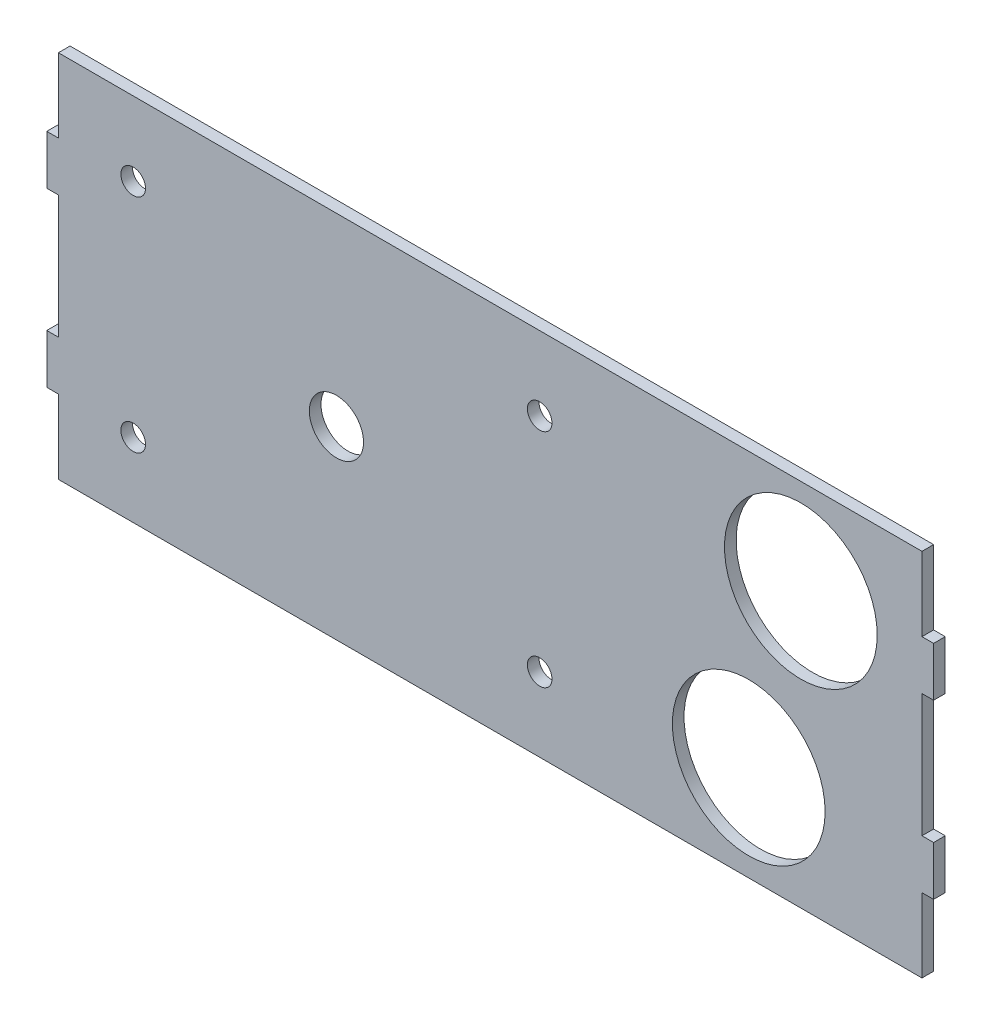
ISO-10303-21;
HEADER;
FILE_DESCRIPTION(('STEP AP214'),'2;1');
FILE_NAME('part.step','',(''),(''),'','','');
FILE_SCHEMA(('AUTOMOTIVE_DESIGN { 1 0 10303 214 1 1 1 1 }'));
ENDSEC;
DATA;
#1=APPLICATION_CONTEXT('core data for automotive mechanical design processes');
#2=APPLICATION_PROTOCOL_DEFINITION('international standard','automotive_design',2000,#1);
#3=PRODUCT_CONTEXT('',#1,'mechanical');
#4=PRODUCT('Part','Part','',(#3));
#5=PRODUCT_RELATED_PRODUCT_CATEGORY('part','',(#4));
#6=PRODUCT_DEFINITION_FORMATION('','',#4);
#7=PRODUCT_DEFINITION_CONTEXT('part definition',#1,'design');
#8=PRODUCT_DEFINITION('design','',#6,#7);
#9=PRODUCT_DEFINITION_SHAPE('','',#8);
#10=(LENGTH_UNIT() NAMED_UNIT(*) SI_UNIT(.MILLI.,.METRE.));
#11=(NAMED_UNIT(*) PLANE_ANGLE_UNIT() SI_UNIT($,.RADIAN.));
#12=(NAMED_UNIT(*) SI_UNIT($,.STERADIAN.) SOLID_ANGLE_UNIT());
#13=UNCERTAINTY_MEASURE_WITH_UNIT(LENGTH_MEASURE(1.E-05),#10,'distance_accuracy_value','');
#14=(GEOMETRIC_REPRESENTATION_CONTEXT(3) GLOBAL_UNCERTAINTY_ASSIGNED_CONTEXT((#13)) GLOBAL_UNIT_ASSIGNED_CONTEXT((#10,
#11,#12)) REPRESENTATION_CONTEXT('',''));
#15=CARTESIAN_POINT('',(0.,0.,0.));
#16=DIRECTION('',(0.,0.,1.));
#17=DIRECTION('',(1.,0.,0.));
#18=AXIS2_PLACEMENT_3D('',#15,#16,#17);
#19=CARTESIAN_POINT('',(-119.363142231198,35.9945777825327,2.3622));
#20=DIRECTION('',(0.,-1.,0.));
#21=DIRECTION('',(0.,0.,-1.));
#22=AXIS2_PLACEMENT_3D('',#19,#20,#21);
#23=PLANE('',#22);
#24=DIRECTION('',(-1.,0.,0.));
#25=VECTOR('',#24,1.);
#26=CARTESIAN_POINT('',(-119.363142231198,35.9945777825327,0.));
#27=LINE('',#26,#25);
#28=CARTESIAN_POINT('',(55.9124577688024,35.9945777825327,0.));
#29=VERTEX_POINT('',#28);
#30=CARTESIAN_POINT('',(-119.363142231198,35.9945777825327,0.));
#31=VERTEX_POINT('',#30);
#32=EDGE_CURVE('E212',#29,#31,#27,.T.);
#33=ORIENTED_EDGE('',*,*,#32,.T.);
#34=DIRECTION('',(0.,0.,-1.));
#35=VECTOR('',#34,1.);
#36=CARTESIAN_POINT('',(-119.363142231198,35.9945777825327,2.3622));
#37=LINE('',#36,#35);
#38=CARTESIAN_POINT('',(-119.363142231198,35.9945777825327,2.3622));
#39=VERTEX_POINT('',#38);
#40=EDGE_CURVE('E11',#39,#31,#37,.T.);
#41=ORIENTED_EDGE('',*,*,#40,.F.);
#42=DIRECTION('',(-1.,0.,0.));
#43=VECTOR('',#42,1.);
#44=CARTESIAN_POINT('',(-119.363142231198,35.9945777825327,2.3622));
#45=LINE('',#44,#43);
#46=CARTESIAN_POINT('',(55.9124577688024,35.9945777825327,2.3622));
#47=VERTEX_POINT('',#46);
#48=EDGE_CURVE('E271',#47,#39,#45,.T.);
#49=ORIENTED_EDGE('',*,*,#48,.F.);
#50=DIRECTION('',(0.,0.,-1.));
#51=VECTOR('',#50,1.);
#52=CARTESIAN_POINT('',(55.9124577688024,35.9945777825327,2.3622));
#53=LINE('',#52,#51);
#54=EDGE_CURVE('E208',#47,#29,#53,.T.);
#55=ORIENTED_EDGE('',*,*,#54,.T.);
#56=EDGE_LOOP('',(#33,#41,#49,#55));
#57=FACE_BOUND('',#56,.T.);
#58=ADVANCED_FACE('F39',(#57),#23,.F.);
#59=CARTESIAN_POINT('',(-119.363142231198,35.9945777825327,2.3622));
#60=DIRECTION('',(1.,0.,0.));
#61=DIRECTION('',(0.,1.,0.));
#62=AXIS2_PLACEMENT_3D('',#59,#60,#61);
#63=PLANE('',#62);
#64=DIRECTION('',(0.,-1.,0.));
#65=VECTOR('',#64,1.);
#66=CARTESIAN_POINT('',(-119.363142231198,35.9945777825327,0.));
#67=LINE('',#66,#65);
#68=CARTESIAN_POINT('',(-119.363142231198,20.9945777825327,0.));
#69=VERTEX_POINT('',#68);
#70=EDGE_CURVE('E216',#31,#69,#67,.T.);
#71=ORIENTED_EDGE('',*,*,#70,.T.);
#72=DIRECTION('',(0.,0.,-1.));
#73=VECTOR('',#72,1.);
#74=CARTESIAN_POINT('',(-119.363142231198,20.9945777825327,2.3622));
#75=LINE('',#74,#73);
#76=CARTESIAN_POINT('',(-119.363142231198,20.9945777825327,2.3622));
#77=VERTEX_POINT('',#76);
#78=EDGE_CURVE('E48',#77,#69,#75,.T.);
#79=ORIENTED_EDGE('',*,*,#78,.F.);
#80=DIRECTION('',(0.,-1.,0.));
#81=VECTOR('',#80,1.);
#82=CARTESIAN_POINT('',(-119.363142231198,35.9945777825327,2.3622));
#83=LINE('',#82,#81);
#84=EDGE_CURVE('E135',#39,#77,#83,.T.);
#85=ORIENTED_EDGE('',*,*,#84,.F.);
#86=ORIENTED_EDGE('',*,*,#40,.T.);
#87=EDGE_LOOP('',(#71,#79,#85,#86));
#88=FACE_BOUND('',#87,.T.);
#89=ADVANCED_FACE('F422',(#88),#63,.F.);
#90=CARTESIAN_POINT('',(-119.363142231198,20.9945777825327,2.3622));
#91=DIRECTION('',(0.,-1.,0.));
#92=DIRECTION('',(0.,0.,-1.));
#93=AXIS2_PLACEMENT_3D('',#90,#91,#92);
#94=PLANE('',#93);
#95=DIRECTION('',(-1.,0.,0.));
#96=VECTOR('',#95,1.);
#97=CARTESIAN_POINT('',(-119.363142231198,20.9945777825327,0.));
#98=LINE('',#97,#96);
#99=CARTESIAN_POINT('',(-121.725342231198,20.9945777825327,0.));
#100=VERTEX_POINT('',#99);
#101=EDGE_CURVE('E220',#69,#100,#98,.T.);
#102=ORIENTED_EDGE('',*,*,#101,.T.);
#103=DIRECTION('',(0.,0.,-1.));
#104=VECTOR('',#103,1.);
#105=CARTESIAN_POINT('',(-121.725342231198,20.9945777825327,2.3622));
#106=LINE('',#105,#104);
#107=CARTESIAN_POINT('',(-121.725342231198,20.9945777825327,2.3622));
#108=VERTEX_POINT('',#107);
#109=EDGE_CURVE('E330',#108,#100,#106,.T.);
#110=ORIENTED_EDGE('',*,*,#109,.F.);
#111=DIRECTION('',(-1.,0.,0.));
#112=VECTOR('',#111,1.);
#113=CARTESIAN_POINT('',(-119.363142231198,20.9945777825327,2.3622));
#114=LINE('',#113,#112);
#115=EDGE_CURVE('E340',#77,#108,#114,.T.);
#116=ORIENTED_EDGE('',*,*,#115,.F.);
#117=ORIENTED_EDGE('',*,*,#78,.T.);
#118=EDGE_LOOP('',(#102,#110,#116,#117));
#119=FACE_BOUND('',#118,.T.);
#120=ADVANCED_FACE('F338',(#119),#94,.F.);
#121=CARTESIAN_POINT('',(-121.725342231198,20.9945777825327,2.3622));
#122=DIRECTION('',(1.,0.,0.));
#123=DIRECTION('',(0.,0.,-1.));
#124=AXIS2_PLACEMENT_3D('',#121,#122,#123);
#125=PLANE('',#124);
#126=DIRECTION('',(0.,-1.,0.));
#127=VECTOR('',#126,1.);
#128=CARTESIAN_POINT('',(-121.725342231198,20.9945777825327,0.));
#129=LINE('',#128,#127);
#130=CARTESIAN_POINT('',(-121.725342231198,10.9945777825327,0.));
#131=VERTEX_POINT('',#130);
#132=EDGE_CURVE('E223',#100,#131,#129,.T.);
#133=ORIENTED_EDGE('',*,*,#132,.T.);
#134=DIRECTION('',(0.,0.,-1.));
#135=VECTOR('',#134,1.);
#136=CARTESIAN_POINT('',(-121.725342231198,10.9945777825327,2.3622));
#137=LINE('',#136,#135);
#138=CARTESIAN_POINT('',(-121.725342231198,10.9945777825327,2.3622));
#139=VERTEX_POINT('',#138);
#140=EDGE_CURVE('E326',#139,#131,#137,.T.);
#141=ORIENTED_EDGE('',*,*,#140,.F.);
#142=DIRECTION('',(0.,-1.,0.));
#143=VECTOR('',#142,1.);
#144=CARTESIAN_POINT('',(-121.725342231198,20.9945777825327,2.3622));
#145=LINE('',#144,#143);
#146=EDGE_CURVE('E359',#108,#139,#145,.T.);
#147=ORIENTED_EDGE('',*,*,#146,.F.);
#148=ORIENTED_EDGE('',*,*,#109,.T.);
#149=EDGE_LOOP('',(#133,#141,#147,#148));
#150=FACE_BOUND('',#149,.T.);
#151=ADVANCED_FACE('F349',(#150),#125,.F.);
#152=CARTESIAN_POINT('',(-121.725342231198,10.9945777825327,2.3622));
#153=DIRECTION('',(0.,1.,0.));
#154=DIRECTION('',(-1.,0.,0.));
#155=AXIS2_PLACEMENT_3D('',#152,#153,#154);
#156=PLANE('',#155);
#157=DIRECTION('',(1.,0.,0.));
#158=VECTOR('',#157,1.);
#159=CARTESIAN_POINT('',(-121.725342231198,10.9945777825327,0.));
#160=LINE('',#159,#158);
#161=CARTESIAN_POINT('',(-119.363142231198,10.9945777825327,0.));
#162=VERTEX_POINT('',#161);
#163=EDGE_CURVE('E226',#131,#162,#160,.T.);
#164=ORIENTED_EDGE('',*,*,#163,.T.);
#165=DIRECTION('',(0.,0.,-1.));
#166=VECTOR('',#165,1.);
#167=CARTESIAN_POINT('',(-119.363142231198,10.9945777825327,2.3622));
#168=LINE('',#167,#166);
#169=CARTESIAN_POINT('',(-119.363142231198,10.9945777825327,2.3622));
#170=VERTEX_POINT('',#169);
#171=EDGE_CURVE('E322',#170,#162,#168,.T.);
#172=ORIENTED_EDGE('',*,*,#171,.F.);
#173=DIRECTION('',(1.,0.,0.));
#174=VECTOR('',#173,1.);
#175=CARTESIAN_POINT('',(-121.725342231198,10.9945777825327,2.3622));
#176=LINE('',#175,#174);
#177=EDGE_CURVE('E355',#139,#170,#176,.T.);
#178=ORIENTED_EDGE('',*,*,#177,.F.);
#179=ORIENTED_EDGE('',*,*,#140,.T.);
#180=EDGE_LOOP('',(#164,#172,#178,#179));
#181=FACE_BOUND('',#180,.T.);
#182=ADVANCED_FACE('F353',(#181),#156,.F.);
#183=CARTESIAN_POINT('',(-119.363142231198,10.9945777825327,2.3622));
#184=DIRECTION('',(1.,0.,0.));
#185=DIRECTION('',(0.,0.,-1.));
#186=AXIS2_PLACEMENT_3D('',#183,#184,#185);
#187=PLANE('',#186);
#188=DIRECTION('',(0.,-1.,0.));
#189=VECTOR('',#188,1.);
#190=CARTESIAN_POINT('',(-119.363142231198,10.9945777825327,0.));
#191=LINE('',#190,#189);
#192=CARTESIAN_POINT('',(-119.363142231198,-14.0054222174673,0.));
#193=VERTEX_POINT('',#192);
#194=EDGE_CURVE('E229',#162,#193,#191,.T.);
#195=ORIENTED_EDGE('',*,*,#194,.T.);
#196=DIRECTION('',(0.,0.,-1.));
#197=VECTOR('',#196,1.);
#198=CARTESIAN_POINT('',(-119.363142231198,-14.0054222174673,2.3622));
#199=LINE('',#198,#197);
#200=CARTESIAN_POINT('',(-119.363142231198,-14.0054222174673,2.3622));
#201=VERTEX_POINT('',#200);
#202=EDGE_CURVE('E318',#201,#193,#199,.T.);
#203=ORIENTED_EDGE('',*,*,#202,.F.);
#204=DIRECTION('',(0.,-1.,0.));
#205=VECTOR('',#204,1.);
#206=CARTESIAN_POINT('',(-119.363142231198,10.9945777825327,2.3622));
#207=LINE('',#206,#205);
#208=EDGE_CURVE('E358',#170,#201,#207,.T.);
#209=ORIENTED_EDGE('',*,*,#208,.F.);
#210=ORIENTED_EDGE('',*,*,#171,.T.);
#211=EDGE_LOOP('',(#195,#203,#209,#210));
#212=FACE_BOUND('',#211,.T.);
#213=ADVANCED_FACE('F435',(#212),#187,.F.);
#214=CARTESIAN_POINT('',(-119.363142231198,-14.0054222174673,2.3622));
#215=DIRECTION('',(0.,-1.,0.));
#216=DIRECTION('',(0.,0.,-1.));
#217=AXIS2_PLACEMENT_3D('',#214,#215,#216);
#218=PLANE('',#217);
#219=DIRECTION('',(-1.,0.,0.));
#220=VECTOR('',#219,1.);
#221=CARTESIAN_POINT('',(-119.363142231198,-14.0054222174673,0.));
#222=LINE('',#221,#220);
#223=CARTESIAN_POINT('',(-121.725342231198,-14.0054222174673,0.));
#224=VERTEX_POINT('',#223);
#225=EDGE_CURVE('E232',#193,#224,#222,.T.);
#226=ORIENTED_EDGE('',*,*,#225,.T.);
#227=DIRECTION('',(0.,0.,-1.));
#228=VECTOR('',#227,1.);
#229=CARTESIAN_POINT('',(-121.725342231198,-14.0054222174673,2.3622));
#230=LINE('',#229,#228);
#231=CARTESIAN_POINT('',(-121.725342231198,-14.0054222174673,2.3622));
#232=VERTEX_POINT('',#231);
#233=EDGE_CURVE('E314',#232,#224,#230,.T.);
#234=ORIENTED_EDGE('',*,*,#233,.F.);
#235=DIRECTION('',(-1.,0.,0.));
#236=VECTOR('',#235,1.);
#237=CARTESIAN_POINT('',(-119.363142231198,-14.0054222174673,2.3622));
#238=LINE('',#237,#236);
#239=EDGE_CURVE('E363',#201,#232,#238,.T.);
#240=ORIENTED_EDGE('',*,*,#239,.F.);
#241=ORIENTED_EDGE('',*,*,#202,.T.);
#242=EDGE_LOOP('',(#226,#234,#240,#241));
#243=FACE_BOUND('',#242,.T.);
#244=ADVANCED_FACE('F438',(#243),#218,.F.);
#245=CARTESIAN_POINT('',(-121.725342231198,-14.0054222174673,2.3622));
#246=DIRECTION('',(1.,0.,0.));
#247=DIRECTION('',(0.,0.,-1.));
#248=AXIS2_PLACEMENT_3D('',#245,#246,#247);
#249=PLANE('',#248);
#250=DIRECTION('',(0.,-1.,0.));
#251=VECTOR('',#250,1.);
#252=CARTESIAN_POINT('',(-121.725342231198,-14.0054222174673,0.));
#253=LINE('',#252,#251);
#254=CARTESIAN_POINT('',(-121.725342231198,-24.0054222174673,0.));
#255=VERTEX_POINT('',#254);
#256=EDGE_CURVE('E235',#224,#255,#253,.T.);
#257=ORIENTED_EDGE('',*,*,#256,.T.);
#258=DIRECTION('',(0.,0.,-1.));
#259=VECTOR('',#258,1.);
#260=CARTESIAN_POINT('',(-121.725342231198,-24.0054222174673,2.3622));
#261=LINE('',#260,#259);
#262=CARTESIAN_POINT('',(-121.725342231198,-24.0054222174673,2.3622));
#263=VERTEX_POINT('',#262);
#264=EDGE_CURVE('E310',#263,#255,#261,.T.);
#265=ORIENTED_EDGE('',*,*,#264,.F.);
#266=DIRECTION('',(0.,-1.,0.));
#267=VECTOR('',#266,1.);
#268=CARTESIAN_POINT('',(-121.725342231198,-14.0054222174673,2.3622));
#269=LINE('',#268,#267);
#270=EDGE_CURVE('E370',#232,#263,#269,.T.);
#271=ORIENTED_EDGE('',*,*,#270,.F.);
#272=ORIENTED_EDGE('',*,*,#233,.T.);
#273=EDGE_LOOP('',(#257,#265,#271,#272));
#274=FACE_BOUND('',#273,.T.);
#275=ADVANCED_FACE('F442',(#274),#249,.F.);
#276=CARTESIAN_POINT('',(-121.725342231198,-24.0054222174673,2.3622));
#277=DIRECTION('',(0.,1.,0.));
#278=DIRECTION('',(-1.,0.,0.));
#279=AXIS2_PLACEMENT_3D('',#276,#277,#278);
#280=PLANE('',#279);
#281=DIRECTION('',(1.,0.,0.));
#282=VECTOR('',#281,1.);
#283=CARTESIAN_POINT('',(-121.725342231198,-24.0054222174673,0.));
#284=LINE('',#283,#282);
#285=CARTESIAN_POINT('',(-119.363142231198,-24.0054222174673,0.));
#286=VERTEX_POINT('',#285);
#287=EDGE_CURVE('E238',#255,#286,#284,.T.);
#288=ORIENTED_EDGE('',*,*,#287,.T.);
#289=DIRECTION('',(0.,0.,-1.));
#290=VECTOR('',#289,1.);
#291=CARTESIAN_POINT('',(-119.363142231198,-24.0054222174673,2.3622));
#292=LINE('',#291,#290);
#293=CARTESIAN_POINT('',(-119.363142231198,-24.0054222174673,2.3622));
#294=VERTEX_POINT('',#293);
#295=EDGE_CURVE('E306',#294,#286,#292,.T.);
#296=ORIENTED_EDGE('',*,*,#295,.F.);
#297=DIRECTION('',(1.,0.,0.));
#298=VECTOR('',#297,1.);
#299=CARTESIAN_POINT('',(-121.725342231198,-24.0054222174673,2.3622));
#300=LINE('',#299,#298);
#301=EDGE_CURVE('E373',#263,#294,#300,.T.);
#302=ORIENTED_EDGE('',*,*,#301,.F.);
#303=ORIENTED_EDGE('',*,*,#264,.T.);
#304=EDGE_LOOP('',(#288,#296,#302,#303));
#305=FACE_BOUND('',#304,.T.);
#306=ADVANCED_FACE('F446',(#305),#280,.F.);
#307=CARTESIAN_POINT('',(-119.363142231198,-24.0054222174673,2.3622));
#308=DIRECTION('',(1.,0.,0.));
#309=DIRECTION('',(0.,0.,-1.));
#310=AXIS2_PLACEMENT_3D('',#307,#308,#309);
#311=PLANE('',#310);
#312=DIRECTION('',(0.,-1.,0.));
#313=VECTOR('',#312,1.);
#314=CARTESIAN_POINT('',(-119.363142231198,-24.0054222174673,0.));
#315=LINE('',#314,#313);
#316=CARTESIAN_POINT('',(-119.363142231198,-39.0054222174672,0.));
#317=VERTEX_POINT('',#316);
#318=EDGE_CURVE('E241',#286,#317,#315,.T.);
#319=ORIENTED_EDGE('',*,*,#318,.T.);
#320=DIRECTION('',(0.,0.,-1.));
#321=VECTOR('',#320,1.);
#322=CARTESIAN_POINT('',(-119.363142231198,-39.0054222174672,2.3622));
#323=LINE('',#322,#321);
#324=CARTESIAN_POINT('',(-119.363142231198,-39.0054222174672,2.3622));
#325=VERTEX_POINT('',#324);
#326=EDGE_CURVE('E302',#325,#317,#323,.T.);
#327=ORIENTED_EDGE('',*,*,#326,.F.);
#328=DIRECTION('',(0.,-1.,0.));
#329=VECTOR('',#328,1.);
#330=CARTESIAN_POINT('',(-119.363142231198,-24.0054222174673,2.3622));
#331=LINE('',#330,#329);
#332=EDGE_CURVE('E376',#294,#325,#331,.T.);
#333=ORIENTED_EDGE('',*,*,#332,.F.);
#334=ORIENTED_EDGE('',*,*,#295,.T.);
#335=EDGE_LOOP('',(#319,#327,#333,#334));
#336=FACE_BOUND('',#335,.T.);
#337=ADVANCED_FACE('F450',(#336),#311,.F.);
#338=CARTESIAN_POINT('',(-119.363142231198,-39.0054222174672,2.3622));
#339=DIRECTION('',(0.,1.,0.));
#340=DIRECTION('',(0.,0.,1.));
#341=AXIS2_PLACEMENT_3D('',#338,#339,#340);
#342=PLANE('',#341);
#343=DIRECTION('',(1.,0.,0.));
#344=VECTOR('',#343,1.);
#345=CARTESIAN_POINT('',(-119.363142231198,-39.0054222174672,0.));
#346=LINE('',#345,#344);
#347=CARTESIAN_POINT('',(55.9124577688025,-39.0054222174672,0.));
#348=VERTEX_POINT('',#347);
#349=EDGE_CURVE('E244',#317,#348,#346,.T.);
#350=ORIENTED_EDGE('',*,*,#349,.T.);
#351=DIRECTION('',(0.,0.,-1.));
#352=VECTOR('',#351,1.);
#353=CARTESIAN_POINT('',(55.9124577688025,-39.0054222174672,2.3622));
#354=LINE('',#353,#352);
#355=CARTESIAN_POINT('',(55.9124577688025,-39.0054222174672,2.3622));
#356=VERTEX_POINT('',#355);
#357=EDGE_CURVE('E298',#356,#348,#354,.T.);
#358=ORIENTED_EDGE('',*,*,#357,.F.);
#359=DIRECTION('',(1.,0.,0.));
#360=VECTOR('',#359,1.);
#361=CARTESIAN_POINT('',(-119.363142231198,-39.0054222174672,2.3622));
#362=LINE('',#361,#360);
#363=EDGE_CURVE('E379',#325,#356,#362,.T.);
#364=ORIENTED_EDGE('',*,*,#363,.F.);
#365=ORIENTED_EDGE('',*,*,#326,.T.);
#366=EDGE_LOOP('',(#350,#358,#364,#365));
#367=FACE_BOUND('',#366,.T.);
#368=ADVANCED_FACE('F454',(#367),#342,.F.);
#369=CARTESIAN_POINT('',(55.9124577688025,-24.0054222174673,2.3622));
#370=DIRECTION('',(-1.,0.,0.));
#371=DIRECTION('',(0.,-1.,0.));
#372=AXIS2_PLACEMENT_3D('',#369,#370,#371);
#373=PLANE('',#372);
#374=DIRECTION('',(0.,1.,0.));
#375=VECTOR('',#374,1.);
#376=CARTESIAN_POINT('',(55.9124577688025,-24.0054222174673,0.));
#377=LINE('',#376,#375);
#378=CARTESIAN_POINT('',(55.9124577688025,-24.0054222174673,0.));
#379=VERTEX_POINT('',#378);
#380=EDGE_CURVE('E247',#348,#379,#377,.T.);
#381=ORIENTED_EDGE('',*,*,#380,.T.);
#382=DIRECTION('',(0.,0.,-1.));
#383=VECTOR('',#382,1.);
#384=CARTESIAN_POINT('',(55.9124577688025,-24.0054222174673,2.3622));
#385=LINE('',#384,#383);
#386=CARTESIAN_POINT('',(55.9124577688025,-24.0054222174673,2.3622));
#387=VERTEX_POINT('',#386);
#388=EDGE_CURVE('E294',#387,#379,#385,.T.);
#389=ORIENTED_EDGE('',*,*,#388,.F.);
#390=DIRECTION('',(0.,1.,0.));
#391=VECTOR('',#390,1.);
#392=CARTESIAN_POINT('',(55.9124577688025,-24.0054222174673,2.3622));
#393=LINE('',#392,#391);
#394=EDGE_CURVE('E382',#356,#387,#393,.T.);
#395=ORIENTED_EDGE('',*,*,#394,.F.);
#396=ORIENTED_EDGE('',*,*,#357,.T.);
#397=EDGE_LOOP('',(#381,#389,#395,#396));
#398=FACE_BOUND('',#397,.T.);
#399=ADVANCED_FACE('F458',(#398),#373,.F.);
#400=CARTESIAN_POINT('',(58.2746577688025,-24.0054222174673,2.3622));
#401=DIRECTION('',(0.,1.,0.));
#402=DIRECTION('',(0.,0.,1.));
#403=AXIS2_PLACEMENT_3D('',#400,#401,#402);
#404=PLANE('',#403);
#405=DIRECTION('',(1.,0.,0.));
#406=VECTOR('',#405,1.);
#407=CARTESIAN_POINT('',(58.2746577688025,-24.0054222174673,0.));
#408=LINE('',#407,#406);
#409=CARTESIAN_POINT('',(58.2746577688025,-24.0054222174673,0.));
#410=VERTEX_POINT('',#409);
#411=EDGE_CURVE('E250',#379,#410,#408,.T.);
#412=ORIENTED_EDGE('',*,*,#411,.T.);
#413=DIRECTION('',(0.,0.,-1.));
#414=VECTOR('',#413,1.);
#415=CARTESIAN_POINT('',(58.2746577688025,-24.0054222174673,2.3622));
#416=LINE('',#415,#414);
#417=CARTESIAN_POINT('',(58.2746577688025,-24.0054222174673,2.3622));
#418=VERTEX_POINT('',#417);
#419=EDGE_CURVE('E290',#418,#410,#416,.T.);
#420=ORIENTED_EDGE('',*,*,#419,.F.);
#421=DIRECTION('',(1.,0.,0.));
#422=VECTOR('',#421,1.);
#423=CARTESIAN_POINT('',(58.2746577688025,-24.0054222174673,2.3622));
#424=LINE('',#423,#422);
#425=EDGE_CURVE('E385',#387,#418,#424,.T.);
#426=ORIENTED_EDGE('',*,*,#425,.F.);
#427=ORIENTED_EDGE('',*,*,#388,.T.);
#428=EDGE_LOOP('',(#412,#420,#426,#427));
#429=FACE_BOUND('',#428,.T.);
#430=ADVANCED_FACE('F462',(#429),#404,.F.);
#431=CARTESIAN_POINT('',(58.2746577688025,-14.0054222174673,2.3622));
#432=DIRECTION('',(-1.,0.,0.));
#433=DIRECTION('',(0.,0.,1.));
#434=AXIS2_PLACEMENT_3D('',#431,#432,#433);
#435=PLANE('',#434);
#436=DIRECTION('',(0.,1.,0.));
#437=VECTOR('',#436,1.);
#438=CARTESIAN_POINT('',(58.2746577688025,-14.0054222174673,0.));
#439=LINE('',#438,#437);
#440=CARTESIAN_POINT('',(58.2746577688025,-14.0054222174673,0.));
#441=VERTEX_POINT('',#440);
#442=EDGE_CURVE('E253',#410,#441,#439,.T.);
#443=ORIENTED_EDGE('',*,*,#442,.T.);
#444=DIRECTION('',(0.,0.,-1.));
#445=VECTOR('',#444,1.);
#446=CARTESIAN_POINT('',(58.2746577688025,-14.0054222174673,2.3622));
#447=LINE('',#446,#445);
#448=CARTESIAN_POINT('',(58.2746577688025,-14.0054222174673,2.3622));
#449=VERTEX_POINT('',#448);
#450=EDGE_CURVE('E286',#449,#441,#447,.T.);
#451=ORIENTED_EDGE('',*,*,#450,.F.);
#452=DIRECTION('',(0.,1.,0.));
#453=VECTOR('',#452,1.);
#454=CARTESIAN_POINT('',(58.2746577688025,-14.0054222174673,2.3622));
#455=LINE('',#454,#453);
#456=EDGE_CURVE('E388',#418,#449,#455,.T.);
#457=ORIENTED_EDGE('',*,*,#456,.F.);
#458=ORIENTED_EDGE('',*,*,#419,.T.);
#459=EDGE_LOOP('',(#443,#451,#457,#458));
#460=FACE_BOUND('',#459,.T.);
#461=ADVANCED_FACE('F466',(#460),#435,.F.);
#462=CARTESIAN_POINT('',(55.9124577688025,-14.0054222174673,2.3622));
#463=DIRECTION('',(0.,-1.,0.));
#464=DIRECTION('',(0.,0.,-1.));
#465=AXIS2_PLACEMENT_3D('',#462,#463,#464);
#466=PLANE('',#465);
#467=DIRECTION('',(-1.,0.,0.));
#468=VECTOR('',#467,1.);
#469=CARTESIAN_POINT('',(55.9124577688025,-14.0054222174673,0.));
#470=LINE('',#469,#468);
#471=CARTESIAN_POINT('',(55.9124577688025,-14.0054222174673,0.));
#472=VERTEX_POINT('',#471);
#473=EDGE_CURVE('E256',#441,#472,#470,.T.);
#474=ORIENTED_EDGE('',*,*,#473,.T.);
#475=DIRECTION('',(0.,0.,-1.));
#476=VECTOR('',#475,1.);
#477=CARTESIAN_POINT('',(55.9124577688025,-14.0054222174673,2.3622));
#478=LINE('',#477,#476);
#479=CARTESIAN_POINT('',(55.9124577688025,-14.0054222174673,2.3622));
#480=VERTEX_POINT('',#479);
#481=EDGE_CURVE('E282',#480,#472,#478,.T.);
#482=ORIENTED_EDGE('',*,*,#481,.F.);
#483=DIRECTION('',(-1.,0.,0.));
#484=VECTOR('',#483,1.);
#485=CARTESIAN_POINT('',(55.9124577688025,-14.0054222174673,2.3622));
#486=LINE('',#485,#484);
#487=EDGE_CURVE('E391',#449,#480,#486,.T.);
#488=ORIENTED_EDGE('',*,*,#487,.F.);
#489=ORIENTED_EDGE('',*,*,#450,.T.);
#490=EDGE_LOOP('',(#474,#482,#488,#489));
#491=FACE_BOUND('',#490,.T.);
#492=ADVANCED_FACE('F470',(#491),#466,.F.);
#493=CARTESIAN_POINT('',(55.9124577688025,10.9945777825327,2.3622));
#494=DIRECTION('',(-1.,0.,0.));
#495=DIRECTION('',(0.,0.,1.));
#496=AXIS2_PLACEMENT_3D('',#493,#494,#495);
#497=PLANE('',#496);
#498=DIRECTION('',(0.,1.,0.));
#499=VECTOR('',#498,1.);
#500=CARTESIAN_POINT('',(55.9124577688025,10.9945777825327,0.));
#501=LINE('',#500,#499);
#502=CARTESIAN_POINT('',(55.9124577688025,10.9945777825327,0.));
#503=VERTEX_POINT('',#502);
#504=EDGE_CURVE('E259',#472,#503,#501,.T.);
#505=ORIENTED_EDGE('',*,*,#504,.T.);
#506=DIRECTION('',(0.,0.,-1.));
#507=VECTOR('',#506,1.);
#508=CARTESIAN_POINT('',(55.9124577688025,10.9945777825327,2.3622));
#509=LINE('',#508,#507);
#510=CARTESIAN_POINT('',(55.9124577688025,10.9945777825327,2.3622));
#511=VERTEX_POINT('',#510);
#512=EDGE_CURVE('E278',#511,#503,#509,.T.);
#513=ORIENTED_EDGE('',*,*,#512,.F.);
#514=DIRECTION('',(0.,1.,0.));
#515=VECTOR('',#514,1.);
#516=CARTESIAN_POINT('',(55.9124577688025,10.9945777825327,2.3622));
#517=LINE('',#516,#515);
#518=EDGE_CURVE('E394',#480,#511,#517,.T.);
#519=ORIENTED_EDGE('',*,*,#518,.F.);
#520=ORIENTED_EDGE('',*,*,#481,.T.);
#521=EDGE_LOOP('',(#505,#513,#519,#520));
#522=FACE_BOUND('',#521,.T.);
#523=ADVANCED_FACE('F402',(#522),#497,.F.);
#524=CARTESIAN_POINT('',(58.2746577688025,10.9945777825327,2.3622));
#525=DIRECTION('',(0.,1.,0.));
#526=DIRECTION('',(-1.,0.,0.));
#527=AXIS2_PLACEMENT_3D('',#524,#525,#526);
#528=PLANE('',#527);
#529=DIRECTION('',(1.,0.,0.));
#530=VECTOR('',#529,1.);
#531=CARTESIAN_POINT('',(58.2746577688025,10.9945777825327,0.));
#532=LINE('',#531,#530);
#533=CARTESIAN_POINT('',(58.2746577688025,10.9945777825327,0.));
#534=VERTEX_POINT('',#533);
#535=EDGE_CURVE('E262',#503,#534,#532,.T.);
#536=ORIENTED_EDGE('',*,*,#535,.T.);
#537=DIRECTION('',(0.,0.,-1.));
#538=VECTOR('',#537,1.);
#539=CARTESIAN_POINT('',(58.2746577688025,10.9945777825327,2.3622));
#540=LINE('',#539,#538);
#541=CARTESIAN_POINT('',(58.2746577688025,10.9945777825327,2.3622));
#542=VERTEX_POINT('',#541);
#543=EDGE_CURVE('E201',#542,#534,#540,.T.);
#544=ORIENTED_EDGE('',*,*,#543,.F.);
#545=DIRECTION('',(1.,0.,0.));
#546=VECTOR('',#545,1.);
#547=CARTESIAN_POINT('',(58.2746577688025,10.9945777825327,2.3622));
#548=LINE('',#547,#546);
#549=EDGE_CURVE('E190',#511,#542,#548,.T.);
#550=ORIENTED_EDGE('',*,*,#549,.F.);
#551=ORIENTED_EDGE('',*,*,#512,.T.);
#552=EDGE_LOOP('',(#536,#544,#550,#551));
#553=FACE_BOUND('',#552,.T.);
#554=ADVANCED_FACE('F406',(#553),#528,.F.);
#555=CARTESIAN_POINT('',(58.2746577688025,20.9945777825327,2.3622));
#556=DIRECTION('',(-1.,0.,0.));
#557=DIRECTION('',(0.,-1.,0.));
#558=AXIS2_PLACEMENT_3D('',#555,#556,#557);
#559=PLANE('',#558);
#560=DIRECTION('',(0.,1.,0.));
#561=VECTOR('',#560,1.);
#562=CARTESIAN_POINT('',(58.2746577688025,20.9945777825327,0.));
#563=LINE('',#562,#561);
#564=CARTESIAN_POINT('',(58.2746577688025,20.9945777825327,0.));
#565=VERTEX_POINT('',#564);
#566=EDGE_CURVE('E199',#534,#565,#563,.T.);
#567=ORIENTED_EDGE('',*,*,#566,.T.);
#568=DIRECTION('',(0.,0.,-1.));
#569=VECTOR('',#568,1.);
#570=CARTESIAN_POINT('',(58.2746577688025,20.9945777825327,2.3622));
#571=LINE('',#570,#569);
#572=CARTESIAN_POINT('',(58.2746577688025,20.9945777825327,2.3622));
#573=VERTEX_POINT('',#572);
#574=EDGE_CURVE('E196',#573,#565,#571,.T.);
#575=ORIENTED_EDGE('',*,*,#574,.F.);
#576=DIRECTION('',(0.,1.,0.));
#577=VECTOR('',#576,1.);
#578=CARTESIAN_POINT('',(58.2746577688025,20.9945777825327,2.3622));
#579=LINE('',#578,#577);
#580=EDGE_CURVE('E184',#542,#573,#579,.T.);
#581=ORIENTED_EDGE('',*,*,#580,.F.);
#582=ORIENTED_EDGE('',*,*,#543,.T.);
#583=EDGE_LOOP('',(#567,#575,#581,#582));
#584=FACE_BOUND('',#583,.T.);
#585=ADVANCED_FACE('F197',(#584),#559,.F.);
#586=CARTESIAN_POINT('',(55.9124577688024,20.9945777825327,2.3622));
#587=DIRECTION('',(0.,-1.,0.));
#588=DIRECTION('',(0.,0.,-1.));
#589=AXIS2_PLACEMENT_3D('',#586,#587,#588);
#590=PLANE('',#589);
#591=DIRECTION('',(-1.,0.,0.));
#592=VECTOR('',#591,1.);
#593=CARTESIAN_POINT('',(55.9124577688024,20.9945777825327,0.));
#594=LINE('',#593,#592);
#595=CARTESIAN_POINT('',(55.9124577688024,20.9945777825327,0.));
#596=VERTEX_POINT('',#595);
#597=EDGE_CURVE('E121',#565,#596,#594,.T.);
#598=ORIENTED_EDGE('',*,*,#597,.T.);
#599=DIRECTION('',(0.,0.,-1.));
#600=VECTOR('',#599,1.);
#601=CARTESIAN_POINT('',(55.9124577688024,20.9945777825327,2.3622));
#602=LINE('',#601,#600);
#603=CARTESIAN_POINT('',(55.9124577688024,20.9945777825327,2.3622));
#604=VERTEX_POINT('',#603);
#605=EDGE_CURVE('E202',#604,#596,#602,.T.);
#606=ORIENTED_EDGE('',*,*,#605,.F.);
#607=DIRECTION('',(-1.,0.,0.));
#608=VECTOR('',#607,1.);
#609=CARTESIAN_POINT('',(55.9124577688024,20.9945777825327,2.3622));
#610=LINE('',#609,#608);
#611=EDGE_CURVE('E188',#573,#604,#610,.T.);
#612=ORIENTED_EDGE('',*,*,#611,.F.);
#613=ORIENTED_EDGE('',*,*,#574,.T.);
#614=EDGE_LOOP('',(#598,#606,#612,#613));
#615=FACE_BOUND('',#614,.T.);
#616=ADVANCED_FACE('F204',(#615),#590,.F.);
#617=CARTESIAN_POINT('',(55.9124577688024,35.9945777825327,2.3622));
#618=DIRECTION('',(-1.,0.,0.));
#619=DIRECTION('',(0.,0.,1.));
#620=AXIS2_PLACEMENT_3D('',#617,#618,#619);
#621=PLANE('',#620);
#622=DIRECTION('',(0.,1.,0.));
#623=VECTOR('',#622,1.);
#624=CARTESIAN_POINT('',(55.9124577688024,35.9945777825327,0.));
#625=LINE('',#624,#623);
#626=EDGE_CURVE('E127',#596,#29,#625,.T.);
#627=ORIENTED_EDGE('',*,*,#626,.T.);
#628=ORIENTED_EDGE('',*,*,#54,.F.);
#629=DIRECTION('',(0.,1.,0.));
#630=VECTOR('',#629,1.);
#631=CARTESIAN_POINT('',(55.9124577688024,35.9945777825327,2.3622));
#632=LINE('',#631,#630);
#633=EDGE_CURVE('E56',#604,#47,#632,.T.);
#634=ORIENTED_EDGE('',*,*,#633,.F.);
#635=ORIENTED_EDGE('',*,*,#605,.T.);
#636=EDGE_LOOP('',(#627,#628,#634,#635));
#637=FACE_BOUND('',#636,.T.);
#638=ADVANCED_FACE('F410',(#637),#621,.F.);
#639=CARTESIAN_POINT('',(0.,0.,2.3622));
#640=DIRECTION('',(0.,0.,-1.));
#641=DIRECTION('',(-1.,0.,0.));
#642=AXIS2_PLACEMENT_3D('',#639,#640,#641);
#643=PLANE('',#642);
#644=CARTESIAN_POINT('',(-62.9319659045439,-1.50542221746725,2.3622));
#645=DIRECTION('',(0.,0.,1.));
#646=DIRECTION('',(1.,0.,0.));
#647=AXIS2_PLACEMENT_3D('',#644,#645,#646);
#648=CIRCLE('',#647,5.49999999999999);
#649=CARTESIAN_POINT('',(-57.4319659045439,-1.50542221746725,2.3622));
#650=VERTEX_POINT('',#649);
#651=EDGE_CURVE('E586',#650,#650,#648,.T.);
#652=ORIENTED_EDGE('',*,*,#651,.F.);
#653=EDGE_LOOP('',(#652));
#654=FACE_BOUND('',#653,.T.);
#655=CARTESIAN_POINT('',(-21.6819659045439,20.9945777825327,2.3622));
#656=DIRECTION('',(0.,0.,1.));
#657=DIRECTION('',(1.,0.,0.));
#658=AXIS2_PLACEMENT_3D('',#655,#656,#657);
#659=CIRCLE('',#658,2.5);
#660=CARTESIAN_POINT('',(-19.1819659045439,20.9945777825327,2.3622));
#661=VERTEX_POINT('',#660);
#662=EDGE_CURVE('E592',#661,#661,#659,.T.);
#663=ORIENTED_EDGE('',*,*,#662,.F.);
#664=EDGE_LOOP('',(#663));
#665=FACE_BOUND('',#664,.T.);
#666=CARTESIAN_POINT('',(-104.181965904544,20.9945777825327,2.3622));
#667=DIRECTION('',(0.,0.,1.));
#668=DIRECTION('',(1.,0.,0.));
#669=AXIS2_PLACEMENT_3D('',#666,#667,#668);
#670=CIRCLE('',#669,2.5);
#671=CARTESIAN_POINT('',(-101.681965904544,20.9945777825327,2.3622));
#672=VERTEX_POINT('',#671);
#673=EDGE_CURVE('E612',#672,#672,#670,.T.);
#674=ORIENTED_EDGE('',*,*,#673,.F.);
#675=EDGE_LOOP('',(#674));
#676=FACE_BOUND('',#675,.T.);
#677=CARTESIAN_POINT('',(20.7536699578264,-19.6112584195055,2.3622));
#678=DIRECTION('',(0.,0.,1.));
#679=DIRECTION('',(1.,0.,0.));
#680=AXIS2_PLACEMENT_3D('',#677,#678,#679);
#681=CIRCLE('',#680,15.5);
#682=CARTESIAN_POINT('',(36.2536699578264,-19.6112584195055,2.3622));
#683=VERTEX_POINT('',#682);
#684=EDGE_CURVE('E604',#683,#683,#681,.T.);
#685=ORIENTED_EDGE('',*,*,#684,.F.);
#686=EDGE_LOOP('',(#685));
#687=FACE_BOUND('',#686,.T.);
#688=CARTESIAN_POINT('',(-21.6819659045439,-24.0054222174673,2.3622));
#689=DIRECTION('',(0.,0.,1.));
#690=DIRECTION('',(1.,0.,0.));
#691=AXIS2_PLACEMENT_3D('',#688,#689,#690);
#692=CIRCLE('',#691,2.5);
#693=CARTESIAN_POINT('',(-19.1819659045439,-24.0054222174673,2.3622));
#694=VERTEX_POINT('',#693);
#695=EDGE_CURVE('E595',#694,#694,#692,.T.);
#696=ORIENTED_EDGE('',*,*,#695,.F.);
#697=EDGE_LOOP('',(#696));
#698=FACE_BOUND('',#697,.T.);
#699=CARTESIAN_POINT('',(-104.181965904544,-24.0054222174673,2.3622));
#700=DIRECTION('',(0.,0.,1.));
#701=DIRECTION('',(1.,0.,0.));
#702=AXIS2_PLACEMENT_3D('',#699,#700,#701);
#703=CIRCLE('',#702,2.5);
#704=CARTESIAN_POINT('',(-101.681965904544,-24.0054222174673,2.3622));
#705=VERTEX_POINT('',#704);
#706=EDGE_CURVE('E635',#705,#705,#703,.T.);
#707=ORIENTED_EDGE('',*,*,#706,.F.);
#708=EDGE_LOOP('',(#707));
#709=FACE_BOUND('',#708,.T.);
#710=CARTESIAN_POINT('',(31.3281344449803,16.7215169978948,2.3622));
#711=DIRECTION('',(0.,0.,1.));
#712=DIRECTION('',(1.,0.,0.));
#713=AXIS2_PLACEMENT_3D('',#710,#711,#712);
#714=CIRCLE('',#713,15.5);
#715=CARTESIAN_POINT('',(46.8281344449803,16.7215169978948,2.3622));
#716=VERTEX_POINT('',#715);
#717=EDGE_CURVE('E603',#716,#716,#714,.T.);
#718=ORIENTED_EDGE('',*,*,#717,.F.);
#719=EDGE_LOOP('',(#718));
#720=FACE_BOUND('',#719,.T.);
#721=ORIENTED_EDGE('',*,*,#48,.T.);
#722=ORIENTED_EDGE('',*,*,#84,.T.);
#723=ORIENTED_EDGE('',*,*,#115,.T.);
#724=ORIENTED_EDGE('',*,*,#146,.T.);
#725=ORIENTED_EDGE('',*,*,#177,.T.);
#726=ORIENTED_EDGE('',*,*,#208,.T.);
#727=ORIENTED_EDGE('',*,*,#239,.T.);
#728=ORIENTED_EDGE('',*,*,#270,.T.);
#729=ORIENTED_EDGE('',*,*,#301,.T.);
#730=ORIENTED_EDGE('',*,*,#332,.T.);
#731=ORIENTED_EDGE('',*,*,#363,.T.);
#732=ORIENTED_EDGE('',*,*,#394,.T.);
#733=ORIENTED_EDGE('',*,*,#425,.T.);
#734=ORIENTED_EDGE('',*,*,#456,.T.);
#735=ORIENTED_EDGE('',*,*,#487,.T.);
#736=ORIENTED_EDGE('',*,*,#518,.T.);
#737=ORIENTED_EDGE('',*,*,#549,.T.);
#738=ORIENTED_EDGE('',*,*,#580,.T.);
#739=ORIENTED_EDGE('',*,*,#611,.T.);
#740=ORIENTED_EDGE('',*,*,#633,.T.);
#741=EDGE_LOOP('',(#721,#722,#723,#724,#725,#726,#727,#728,#729,#730,#731,#732,#733,#734,#735,
#736,#737,#738,#739,#740));
#742=FACE_BOUND('',#741,.T.);
#743=ADVANCED_FACE('F186',(#654,#665,#676,#687,#698,#709,#720,#742),#643,.F.);
#744=CARTESIAN_POINT('',(0.,0.,0.));
#745=DIRECTION('',(0.,0.,-1.));
#746=DIRECTION('',(-1.,0.,0.));
#747=AXIS2_PLACEMENT_3D('',#744,#745,#746);
#748=PLANE('',#747);
#749=CARTESIAN_POINT('',(-62.9319659045439,-1.50542221746725,0.));
#750=DIRECTION('',(0.,0.,1.));
#751=DIRECTION('',(1.,0.,0.));
#752=AXIS2_PLACEMENT_3D('',#749,#750,#751);
#753=CIRCLE('',#752,5.49999999999999);
#754=CARTESIAN_POINT('',(-57.4319659045439,-1.50542221746725,0.));
#755=VERTEX_POINT('',#754);
#756=EDGE_CURVE('E583',#755,#755,#753,.T.);
#757=ORIENTED_EDGE('',*,*,#756,.T.);
#758=EDGE_LOOP('',(#757));
#759=FACE_BOUND('',#758,.T.);
#760=CARTESIAN_POINT('',(-21.6819659045439,20.9945777825327,0.));
#761=DIRECTION('',(0.,0.,1.));
#762=DIRECTION('',(1.,0.,0.));
#763=AXIS2_PLACEMENT_3D('',#760,#761,#762);
#764=CIRCLE('',#763,2.5);
#765=CARTESIAN_POINT('',(-19.1819659045439,20.9945777825327,0.));
#766=VERTEX_POINT('',#765);
#767=EDGE_CURVE('E616',#766,#766,#764,.T.);
#768=ORIENTED_EDGE('',*,*,#767,.T.);
#769=EDGE_LOOP('',(#768));
#770=FACE_BOUND('',#769,.T.);
#771=CARTESIAN_POINT('',(-104.181965904544,20.9945777825327,0.));
#772=DIRECTION('',(0.,0.,1.));
#773=DIRECTION('',(1.,0.,0.));
#774=AXIS2_PLACEMENT_3D('',#771,#772,#773);
#775=CIRCLE('',#774,2.5);
#776=CARTESIAN_POINT('',(-101.681965904544,20.9945777825327,0.));
#777=VERTEX_POINT('',#776);
#778=EDGE_CURVE('E608',#777,#777,#775,.T.);
#779=ORIENTED_EDGE('',*,*,#778,.T.);
#780=EDGE_LOOP('',(#779));
#781=FACE_BOUND('',#780,.T.);
#782=CARTESIAN_POINT('',(20.7536699578264,-19.6112584195055,0.));
#783=DIRECTION('',(0.,0.,1.));
#784=DIRECTION('',(1.,0.,0.));
#785=AXIS2_PLACEMENT_3D('',#782,#783,#784);
#786=CIRCLE('',#785,15.5);
#787=CARTESIAN_POINT('',(36.2536699578264,-19.6112584195055,0.));
#788=VERTEX_POINT('',#787);
#789=EDGE_CURVE('E599',#788,#788,#786,.T.);
#790=ORIENTED_EDGE('',*,*,#789,.T.);
#791=EDGE_LOOP('',(#790));
#792=FACE_BOUND('',#791,.T.);
#793=CARTESIAN_POINT('',(-21.6819659045439,-24.0054222174673,0.));
#794=DIRECTION('',(0.,0.,1.));
#795=DIRECTION('',(1.,0.,0.));
#796=AXIS2_PLACEMENT_3D('',#793,#794,#795);
#797=CIRCLE('',#796,2.5);
#798=CARTESIAN_POINT('',(-19.1819659045439,-24.0054222174673,0.));
#799=VERTEX_POINT('',#798);
#800=EDGE_CURVE('E588',#799,#799,#797,.T.);
#801=ORIENTED_EDGE('',*,*,#800,.T.);
#802=EDGE_LOOP('',(#801));
#803=FACE_BOUND('',#802,.T.);
#804=CARTESIAN_POINT('',(-104.181965904544,-24.0054222174673,0.));
#805=DIRECTION('',(0.,0.,1.));
#806=DIRECTION('',(1.,0.,0.));
#807=AXIS2_PLACEMENT_3D('',#804,#805,#806);
#808=CIRCLE('',#807,2.5);
#809=CARTESIAN_POINT('',(-101.681965904544,-24.0054222174673,0.));
#810=VERTEX_POINT('',#809);
#811=EDGE_CURVE('E639',#810,#810,#808,.T.);
#812=ORIENTED_EDGE('',*,*,#811,.T.);
#813=EDGE_LOOP('',(#812));
#814=FACE_BOUND('',#813,.T.);
#815=CARTESIAN_POINT('',(31.3281344449803,16.7215169978948,0.));
#816=DIRECTION('',(0.,0.,1.));
#817=DIRECTION('',(1.,0.,0.));
#818=AXIS2_PLACEMENT_3D('',#815,#816,#817);
#819=CIRCLE('',#818,15.5);
#820=CARTESIAN_POINT('',(46.8281344449803,16.7215169978948,0.));
#821=VERTEX_POINT('',#820);
#822=EDGE_CURVE('E217',#821,#821,#819,.T.);
#823=ORIENTED_EDGE('',*,*,#822,.T.);
#824=EDGE_LOOP('',(#823));
#825=FACE_BOUND('',#824,.T.);
#826=ORIENTED_EDGE('',*,*,#32,.F.);
#827=ORIENTED_EDGE('',*,*,#626,.F.);
#828=ORIENTED_EDGE('',*,*,#597,.F.);
#829=ORIENTED_EDGE('',*,*,#566,.F.);
#830=ORIENTED_EDGE('',*,*,#535,.F.);
#831=ORIENTED_EDGE('',*,*,#504,.F.);
#832=ORIENTED_EDGE('',*,*,#473,.F.);
#833=ORIENTED_EDGE('',*,*,#442,.F.);
#834=ORIENTED_EDGE('',*,*,#411,.F.);
#835=ORIENTED_EDGE('',*,*,#380,.F.);
#836=ORIENTED_EDGE('',*,*,#349,.F.);
#837=ORIENTED_EDGE('',*,*,#318,.F.);
#838=ORIENTED_EDGE('',*,*,#287,.F.);
#839=ORIENTED_EDGE('',*,*,#256,.F.);
#840=ORIENTED_EDGE('',*,*,#225,.F.);
#841=ORIENTED_EDGE('',*,*,#194,.F.);
#842=ORIENTED_EDGE('',*,*,#163,.F.);
#843=ORIENTED_EDGE('',*,*,#132,.F.);
#844=ORIENTED_EDGE('',*,*,#101,.F.);
#845=ORIENTED_EDGE('',*,*,#70,.F.);
#846=EDGE_LOOP('',(#826,#827,#828,#829,#830,#831,#832,#833,#834,#835,#836,#837,#838,#839,#840,
#841,#842,#843,#844,#845));
#847=FACE_BOUND('',#846,.T.);
#848=ADVANCED_FACE('F344',(#759,#770,#781,#792,#803,#814,#825,#847),#748,.T.);
#849=CARTESIAN_POINT('',(31.3281344449803,16.7215169978948,0.));
#850=DIRECTION('',(0.,0.,1.));
#851=DIRECTION('',(1.,0.,0.));
#852=AXIS2_PLACEMENT_3D('',#849,#850,#851);
#853=CYLINDRICAL_SURFACE('',#852,15.5);
#854=ORIENTED_EDGE('',*,*,#822,.F.);
#855=EDGE_LOOP('',(#854));
#856=FACE_BOUND('',#855,.T.);
#857=ORIENTED_EDGE('',*,*,#717,.T.);
#858=EDGE_LOOP('',(#857));
#859=FACE_BOUND('',#858,.T.);
#860=ADVANCED_FACE('F507',(#856,#859),#853,.F.);
#861=CARTESIAN_POINT('',(-104.181965904544,-24.0054222174673,0.));
#862=DIRECTION('',(0.,0.,1.));
#863=DIRECTION('',(1.,0.,0.));
#864=AXIS2_PLACEMENT_3D('',#861,#862,#863);
#865=CYLINDRICAL_SURFACE('',#864,2.5);
#866=ORIENTED_EDGE('',*,*,#811,.F.);
#867=EDGE_LOOP('',(#866));
#868=FACE_BOUND('',#867,.T.);
#869=ORIENTED_EDGE('',*,*,#706,.T.);
#870=EDGE_LOOP('',(#869));
#871=FACE_BOUND('',#870,.T.);
#872=ADVANCED_FACE('F516',(#868,#871),#865,.F.);
#873=CARTESIAN_POINT('',(-21.6819659045439,-24.0054222174673,0.));
#874=DIRECTION('',(0.,0.,1.));
#875=DIRECTION('',(1.,0.,0.));
#876=AXIS2_PLACEMENT_3D('',#873,#874,#875);
#877=CYLINDRICAL_SURFACE('',#876,2.5);
#878=ORIENTED_EDGE('',*,*,#800,.F.);
#879=EDGE_LOOP('',(#878));
#880=FACE_BOUND('',#879,.T.);
#881=ORIENTED_EDGE('',*,*,#695,.T.);
#882=EDGE_LOOP('',(#881));
#883=FACE_BOUND('',#882,.T.);
#884=ADVANCED_FACE('F526',(#880,#883),#877,.F.);
#885=CARTESIAN_POINT('',(20.7536699578264,-19.6112584195055,0.));
#886=DIRECTION('',(0.,0.,1.));
#887=DIRECTION('',(1.,0.,0.));
#888=AXIS2_PLACEMENT_3D('',#885,#886,#887);
#889=CYLINDRICAL_SURFACE('',#888,15.5);
#890=ORIENTED_EDGE('',*,*,#789,.F.);
#891=EDGE_LOOP('',(#890));
#892=FACE_BOUND('',#891,.T.);
#893=ORIENTED_EDGE('',*,*,#684,.T.);
#894=EDGE_LOOP('',(#893));
#895=FACE_BOUND('',#894,.T.);
#896=ADVANCED_FACE('F536',(#892,#895),#889,.F.);
#897=CARTESIAN_POINT('',(-104.181965904544,20.9945777825327,0.));
#898=DIRECTION('',(0.,0.,1.));
#899=DIRECTION('',(1.,0.,0.));
#900=AXIS2_PLACEMENT_3D('',#897,#898,#899);
#901=CYLINDRICAL_SURFACE('',#900,2.5);
#902=ORIENTED_EDGE('',*,*,#778,.F.);
#903=EDGE_LOOP('',(#902));
#904=FACE_BOUND('',#903,.T.);
#905=ORIENTED_EDGE('',*,*,#673,.T.);
#906=EDGE_LOOP('',(#905));
#907=FACE_BOUND('',#906,.T.);
#908=ADVANCED_FACE('F546',(#904,#907),#901,.F.);
#909=CARTESIAN_POINT('',(-21.6819659045439,20.9945777825327,0.));
#910=DIRECTION('',(0.,0.,1.));
#911=DIRECTION('',(1.,0.,0.));
#912=AXIS2_PLACEMENT_3D('',#909,#910,#911);
#913=CYLINDRICAL_SURFACE('',#912,2.5);
#914=ORIENTED_EDGE('',*,*,#767,.F.);
#915=EDGE_LOOP('',(#914));
#916=FACE_BOUND('',#915,.T.);
#917=ORIENTED_EDGE('',*,*,#662,.T.);
#918=EDGE_LOOP('',(#917));
#919=FACE_BOUND('',#918,.T.);
#920=ADVANCED_FACE('F556',(#916,#919),#913,.F.);
#921=CARTESIAN_POINT('',(-62.9319659045439,-1.50542221746725,0.));
#922=DIRECTION('',(0.,0.,1.));
#923=DIRECTION('',(1.,0.,0.));
#924=AXIS2_PLACEMENT_3D('',#921,#922,#923);
#925=CYLINDRICAL_SURFACE('',#924,5.49999999999999);
#926=ORIENTED_EDGE('',*,*,#756,.F.);
#927=EDGE_LOOP('',(#926));
#928=FACE_BOUND('',#927,.T.);
#929=ORIENTED_EDGE('',*,*,#651,.T.);
#930=EDGE_LOOP('',(#929));
#931=FACE_BOUND('',#930,.T.);
#932=ADVANCED_FACE('F566',(#928,#931),#925,.F.);
#933=CLOSED_SHELL('',(#58,#89,#120,#151,#182,#213,#244,#275,#306,#337,#368,#399,#430,#461,#492,
#523,#554,#585,#616,#638,#743,#848,#860,#872,#884,#896,#908,#920,#932));
#934=MANIFOLD_SOLID_BREP('B2',#933);
#935=ADVANCED_BREP_SHAPE_REPRESENTATION('',(#18,#934),#14);
#936=SHAPE_DEFINITION_REPRESENTATION(#9,#935);
ENDSEC;
END-ISO-10303-21;
